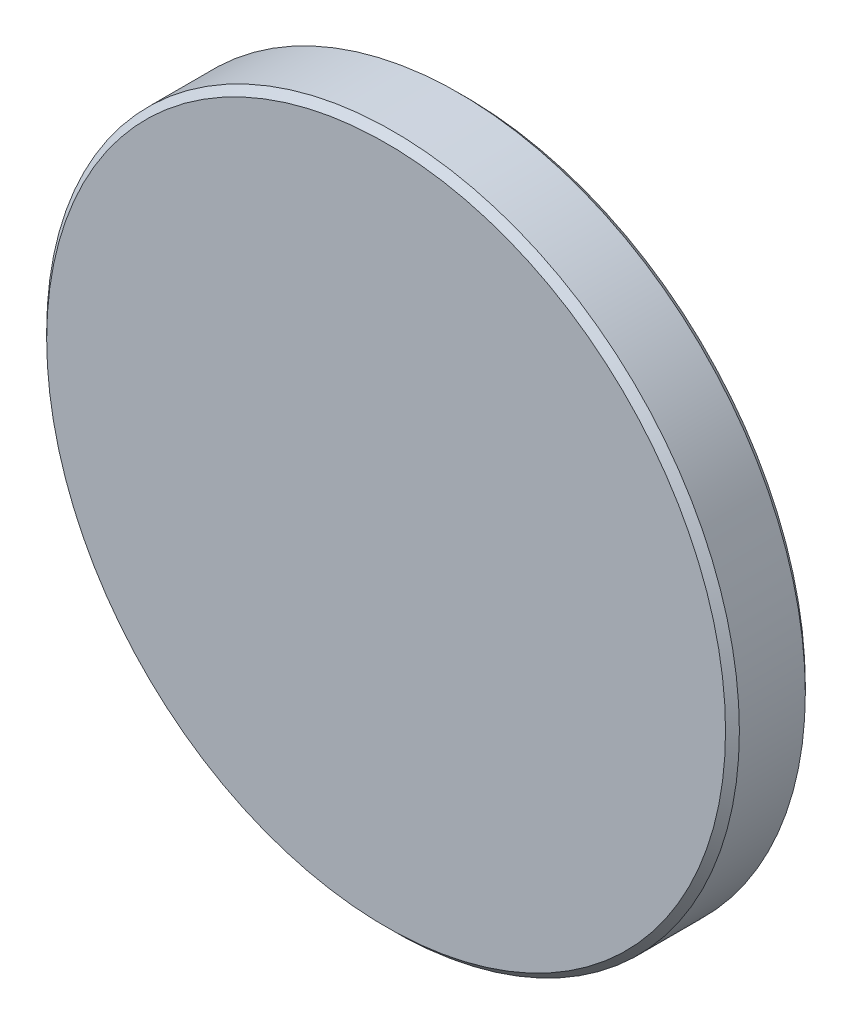
ISO-10303-21;
HEADER;
FILE_DESCRIPTION(('STEP AP214'),'2;1');
FILE_NAME('part.step','',(''),(''),'','','');
FILE_SCHEMA(('AUTOMOTIVE_DESIGN { 1 0 10303 214 1 1 1 1 }'));
ENDSEC;
DATA;
#1=APPLICATION_CONTEXT('core data for automotive mechanical design processes');
#2=APPLICATION_PROTOCOL_DEFINITION('international standard','automotive_design',2000,#1);
#3=PRODUCT_CONTEXT('',#1,'mechanical');
#4=PRODUCT('Part','Part','',(#3));
#5=PRODUCT_RELATED_PRODUCT_CATEGORY('part','',(#4));
#6=PRODUCT_DEFINITION_FORMATION('','',#4);
#7=PRODUCT_DEFINITION_CONTEXT('part definition',#1,'design');
#8=PRODUCT_DEFINITION('design','',#6,#7);
#9=PRODUCT_DEFINITION_SHAPE('','',#8);
#10=(LENGTH_UNIT() NAMED_UNIT(*) SI_UNIT(.MILLI.,.METRE.));
#11=(NAMED_UNIT(*) PLANE_ANGLE_UNIT() SI_UNIT($,.RADIAN.));
#12=(NAMED_UNIT(*) SI_UNIT($,.STERADIAN.) SOLID_ANGLE_UNIT());
#13=UNCERTAINTY_MEASURE_WITH_UNIT(LENGTH_MEASURE(1.E-05),#10,'distance_accuracy_value','');
#14=(GEOMETRIC_REPRESENTATION_CONTEXT(3) GLOBAL_UNCERTAINTY_ASSIGNED_CONTEXT((#13)) GLOBAL_UNIT_ASSIGNED_CONTEXT((#10,
#11,#12)) REPRESENTATION_CONTEXT('',''));
#15=CARTESIAN_POINT('',(0.,0.,0.));
#16=DIRECTION('',(0.,0.,1.));
#17=DIRECTION('',(1.,0.,0.));
#18=AXIS2_PLACEMENT_3D('',#15,#16,#17);
#19=CARTESIAN_POINT('',(0.,0.,1.44));
#20=DIRECTION('',(0.,0.,-1.));
#21=DIRECTION('',(-1.,0.,0.));
#22=AXIS2_PLACEMENT_3D('',#19,#20,#21);
#23=CYLINDRICAL_SURFACE('',#22,12.5);
#24=CARTESIAN_POINT('',(0.,0.,-1.18999999999999));
#25=DIRECTION('',(0.,0.,1.));
#26=DIRECTION('',(1.,0.,0.));
#27=AXIS2_PLACEMENT_3D('',#24,#25,#26);
#28=CIRCLE('',#27,12.5);
#29=CARTESIAN_POINT('',(-12.5,0.,-1.18999999999999));
#30=VERTEX_POINT('',#29);
#31=EDGE_CURVE('E25',#30,#30,#28,.T.);
#32=CARTESIAN_POINT('',(0.,0.,1.19000000000001));
#33=DIRECTION('',(0.,0.,1.));
#34=DIRECTION('',(1.,0.,0.));
#35=AXIS2_PLACEMENT_3D('',#32,#33,#34);
#36=CIRCLE('',#35,12.5);
#37=CARTESIAN_POINT('',(-12.5,0.,1.19000000000001));
#38=VERTEX_POINT('',#37);
#39=EDGE_CURVE('E29',#38,#38,#36,.F.);
#40=CARTESIAN_POINT('',(-12.5,0.,-1.18999999999999));
#41=CARTESIAN_POINT('',(-12.5,0.,-1.16520833333332));
#42=CARTESIAN_POINT('',(-12.5,0.,-1.14041666666665));
#43=CARTESIAN_POINT('',(-12.5,0.,-1.09083333333332));
#44=CARTESIAN_POINT('',(-12.5,0.,-1.06604166666665));
#45=CARTESIAN_POINT('',(-12.5,0.,-1.01645833333332));
#46=CARTESIAN_POINT('',(-12.5,0.,-0.991666666666654));
#47=CARTESIAN_POINT('',(-12.5,0.,-0.942083333333321));
#48=CARTESIAN_POINT('',(-12.5,0.,-0.917291666666655));
#49=CARTESIAN_POINT('',(-12.5,0.,-0.867708333333321));
#50=CARTESIAN_POINT('',(-12.5,0.,-0.842916666666654));
#51=CARTESIAN_POINT('',(-12.5,0.,-0.793333333333321));
#52=CARTESIAN_POINT('',(-12.5,0.,-0.768541666666654));
#53=CARTESIAN_POINT('',(-12.5,0.,-0.718958333333321));
#54=CARTESIAN_POINT('',(-12.5,0.,-0.694166666666654));
#55=CARTESIAN_POINT('',(-12.5,0.,-0.644583333333321));
#56=CARTESIAN_POINT('',(-12.5,0.,-0.619791666666654));
#57=CARTESIAN_POINT('',(-12.5,0.,-0.570208333333321));
#58=CARTESIAN_POINT('',(-12.5,0.,-0.545416666666654));
#59=CARTESIAN_POINT('',(-12.5,0.,-0.495833333333321));
#60=CARTESIAN_POINT('',(-12.5,0.,-0.471041666666654));
#61=CARTESIAN_POINT('',(-12.5,0.,-0.421458333333321));
#62=CARTESIAN_POINT('',(-12.5,0.,-0.396666666666654));
#63=CARTESIAN_POINT('',(-12.5,0.,-0.347083333333321));
#64=CARTESIAN_POINT('',(-12.5,0.,-0.322291666666654));
#65=CARTESIAN_POINT('',(-12.5,0.,-0.272708333333321));
#66=CARTESIAN_POINT('',(-12.5,0.,-0.247916666666654));
#67=CARTESIAN_POINT('',(-12.5,0.,-0.198333333333321));
#68=CARTESIAN_POINT('',(-12.5,0.,-0.173541666666654));
#69=CARTESIAN_POINT('',(-12.5,0.,-0.123958333333321));
#70=CARTESIAN_POINT('',(-12.5,0.,-0.0991666666666539));
#71=CARTESIAN_POINT('',(-12.5,0.,-0.0495833333333205));
#72=CARTESIAN_POINT('',(-12.5,0.,-0.0247916666666539));
#73=CARTESIAN_POINT('',(-12.5,0.,0.0247916666666795));
#74=CARTESIAN_POINT('',(-12.5,0.,0.0495833333333461));
#75=CARTESIAN_POINT('',(-12.5,0.,0.0991666666666795));
#76=CARTESIAN_POINT('',(-12.5,0.,0.123958333333346));
#77=CARTESIAN_POINT('',(-12.5,0.,0.17354166666668));
#78=CARTESIAN_POINT('',(-12.5,0.,0.198333333333346));
#79=CARTESIAN_POINT('',(-12.5,0.,0.24791666666668));
#80=CARTESIAN_POINT('',(-12.5,0.,0.272708333333346));
#81=CARTESIAN_POINT('',(-12.5,0.,0.32229166666668));
#82=CARTESIAN_POINT('',(-12.5,0.,0.347083333333346));
#83=CARTESIAN_POINT('',(-12.5,0.,0.39666666666668));
#84=CARTESIAN_POINT('',(-12.5,0.,0.421458333333347));
#85=CARTESIAN_POINT('',(-12.5,0.,0.47104166666668));
#86=CARTESIAN_POINT('',(-12.5,0.,0.495833333333347));
#87=CARTESIAN_POINT('',(-12.5,0.,0.54541666666668));
#88=CARTESIAN_POINT('',(-12.5,0.,0.570208333333347));
#89=CARTESIAN_POINT('',(-12.5,0.,0.61979166666668));
#90=CARTESIAN_POINT('',(-12.5,0.,0.644583333333346));
#91=CARTESIAN_POINT('',(-12.5,0.,0.69416666666668));
#92=CARTESIAN_POINT('',(-12.5,0.,0.718958333333346));
#93=CARTESIAN_POINT('',(-12.5,0.,0.76854166666668));
#94=CARTESIAN_POINT('',(-12.5,0.,0.793333333333347));
#95=CARTESIAN_POINT('',(-12.5,0.,0.84291666666668));
#96=CARTESIAN_POINT('',(-12.5,0.,0.867708333333347));
#97=CARTESIAN_POINT('',(-12.5,0.,0.91729166666668));
#98=CARTESIAN_POINT('',(-12.5,0.,0.942083333333347));
#99=CARTESIAN_POINT('',(-12.5,0.,0.99166666666668));
#100=CARTESIAN_POINT('',(-12.5,0.,1.01645833333335));
#101=CARTESIAN_POINT('',(-12.5,0.,1.06604166666668));
#102=CARTESIAN_POINT('',(-12.5,0.,1.09083333333335));
#103=CARTESIAN_POINT('',(-12.5,0.,1.14041666666668));
#104=CARTESIAN_POINT('',(-12.5,0.,1.16520833333335));
#105=CARTESIAN_POINT('',(-12.5,0.,1.19000000000001));
#106=B_SPLINE_CURVE_WITH_KNOTS('',3,(#40,#41,#42,#43,#44,#45,#46,#47,#48,#49,#50,#51,#52,#53,
#54,#55,#56,#57,#58,#59,#60,#61,#62,#63,#64,#65,#66,#67,#68,#69,#70,#71,#72,#73,#74,#75,#76,#77,
#78,#79,#80,#81,#82,#83,#84,#85,#86,#87,#88,#89,#90,#91,#92,#93,#94,#95,#96,#97,#98,#99,#100,
#101,#102,#103,#104,#105),.UNSPECIFIED.,.F.,.F.,(4,2,2,2,2,2,2,2,2,2,2,2,2,2,2,2,2,2,2,2,2,2,2,
2,2,2,2,2,2,2,2,2,4),(0.,0.0743750000000002,0.14875,0.223125,0.2975,0.371875,0.44625,0.520625,
0.595000000000001,0.669375000000001,0.74375,0.818125000000001,0.892500000000001,0.966875,
1.04125,1.115625,1.19,1.264375,1.33875,1.413125,1.4875,1.561875,1.63625,1.710625,1.785,1.859375,
1.93375,2.008125,2.0825,2.156875,2.23125,2.305625,2.38),.UNSPECIFIED.);
#107=EDGE_CURVE('BSEAM14',#30,#38,#106,.T.);
#108=ORIENTED_EDGE('',*,*,#31,.T.);
#109=ORIENTED_EDGE('',*,*,#39,.T.);
#110=ORIENTED_EDGE('',*,*,#107,.T.);
#111=ORIENTED_EDGE('',*,*,#107,.F.);
#112=EDGE_LOOP('',(#108,#110,#109,#111));
#113=FACE_BOUND('',#112,.T.);
#114=ADVANCED_FACE('F14',(#113),#23,.T.);
#115=CARTESIAN_POINT('',(0.,0.,1.44));
#116=DIRECTION('',(0.,0.,1.));
#117=DIRECTION('',(1.,0.,0.));
#118=AXIS2_PLACEMENT_3D('',#115,#116,#117);
#119=PLANE('',#118);
#120=CARTESIAN_POINT('',(0.,0.,1.44));
#121=DIRECTION('',(0.,0.,1.));
#122=DIRECTION('',(1.,0.,0.));
#123=AXIS2_PLACEMENT_3D('',#120,#121,#122);
#124=CIRCLE('',#123,12.25);
#125=CARTESIAN_POINT('',(12.25,0.,1.44));
#126=VERTEX_POINT('',#125);
#127=EDGE_CURVE('E9',#126,#126,#124,.T.);
#128=ORIENTED_EDGE('',*,*,#127,.T.);
#129=EDGE_LOOP('',(#128));
#130=FACE_BOUND('',#129,.T.);
#131=ADVANCED_FACE('F46',(#130),#119,.T.);
#132=CARTESIAN_POINT('',(0.,0.,-1.44));
#133=DIRECTION('',(0.,0.,1.));
#134=DIRECTION('',(1.,0.,0.));
#135=AXIS2_PLACEMENT_3D('',#132,#133,#134);
#136=PLANE('',#135);
#137=CARTESIAN_POINT('',(0.,0.,-1.44));
#138=DIRECTION('',(0.,0.,1.));
#139=DIRECTION('',(1.,0.,0.));
#140=AXIS2_PLACEMENT_3D('',#137,#138,#139);
#141=CIRCLE('',#140,12.25);
#142=CARTESIAN_POINT('',(12.25,0.,-1.44));
#143=VERTEX_POINT('',#142);
#144=EDGE_CURVE('E21',#143,#143,#141,.F.);
#145=ORIENTED_EDGE('',*,*,#144,.T.);
#146=EDGE_LOOP('',(#145));
#147=FACE_BOUND('',#146,.T.);
#148=ADVANCED_FACE('F43',(#147),#136,.F.);
#149=CARTESIAN_POINT('',(0.,0.,-1.18999999999999));
#150=DIRECTION('',(0.,0.,1.));
#151=DIRECTION('',(1.,0.,0.));
#152=AXIS2_PLACEMENT_3D('',#149,#150,#151);
#153=CONICAL_SURFACE('',#152,12.5,0.785398163397448);
#154=ORIENTED_EDGE('',*,*,#144,.F.);
#155=EDGE_LOOP('',(#154));
#156=FACE_BOUND('',#155,.T.);
#157=ORIENTED_EDGE('',*,*,#31,.F.);
#158=EDGE_LOOP('',(#157));
#159=FACE_BOUND('',#158,.T.);
#160=ADVANCED_FACE('F38',(#156,#159),#153,.T.);
#161=CARTESIAN_POINT('',(0.,0.,1.44));
#162=DIRECTION('',(0.,0.,-1.));
#163=DIRECTION('',(-1.,0.,0.));
#164=AXIS2_PLACEMENT_3D('',#161,#162,#163);
#165=CONICAL_SURFACE('',#164,12.25,0.785398163397445);
#166=ORIENTED_EDGE('',*,*,#39,.F.);
#167=EDGE_LOOP('',(#166));
#168=FACE_BOUND('',#167,.T.);
#169=ORIENTED_EDGE('',*,*,#127,.F.);
#170=EDGE_LOOP('',(#169));
#171=FACE_BOUND('',#170,.T.);
#172=ADVANCED_FACE('F16',(#168,#171),#165,.T.);
#173=CLOSED_SHELL('',(#114,#131,#148,#160,#172));
#174=MANIFOLD_SOLID_BREP('B1',#173);
#175=ADVANCED_BREP_SHAPE_REPRESENTATION('',(#18,#174),#14);
#176=SHAPE_DEFINITION_REPRESENTATION(#9,#175);
ENDSEC;
END-ISO-10303-21;
